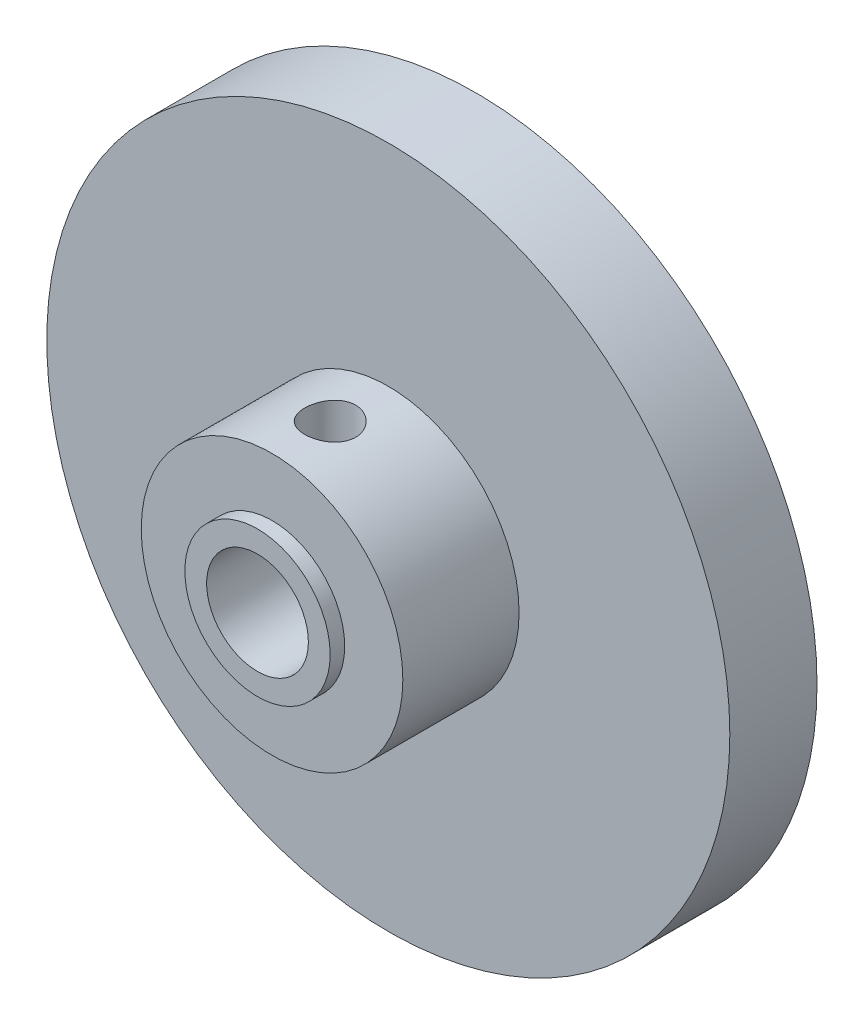
ISO-10303-21;
HEADER;
FILE_DESCRIPTION(('STEP AP214'),'2;1');
FILE_NAME('part.step','',(''),(''),'','','');
FILE_SCHEMA(('AUTOMOTIVE_DESIGN { 1 0 10303 214 1 1 1 1 }'));
ENDSEC;
DATA;
#1=APPLICATION_CONTEXT('core data for automotive mechanical design processes');
#2=APPLICATION_PROTOCOL_DEFINITION('international standard','automotive_design',2000,#1);
#3=PRODUCT_CONTEXT('',#1,'mechanical');
#4=PRODUCT('Part','Part','',(#3));
#5=PRODUCT_RELATED_PRODUCT_CATEGORY('part','',(#4));
#6=PRODUCT_DEFINITION_FORMATION('','',#4);
#7=PRODUCT_DEFINITION_CONTEXT('part definition',#1,'design');
#8=PRODUCT_DEFINITION('design','',#6,#7);
#9=PRODUCT_DEFINITION_SHAPE('','',#8);
#10=(LENGTH_UNIT() NAMED_UNIT(*) SI_UNIT(.MILLI.,.METRE.));
#11=(NAMED_UNIT(*) PLANE_ANGLE_UNIT() SI_UNIT($,.RADIAN.));
#12=(NAMED_UNIT(*) SI_UNIT($,.STERADIAN.) SOLID_ANGLE_UNIT());
#13=UNCERTAINTY_MEASURE_WITH_UNIT(LENGTH_MEASURE(1.E-05),#10,'distance_accuracy_value','');
#14=(GEOMETRIC_REPRESENTATION_CONTEXT(3) GLOBAL_UNCERTAINTY_ASSIGNED_CONTEXT((#13)) GLOBAL_UNIT_ASSIGNED_CONTEXT((#10,
#11,#12)) REPRESENTATION_CONTEXT('',''));
#15=CARTESIAN_POINT('',(0.,0.,0.));
#16=DIRECTION('',(0.,0.,1.));
#17=DIRECTION('',(1.,0.,0.));
#18=AXIS2_PLACEMENT_3D('',#15,#16,#17);
#19=CARTESIAN_POINT('',(0.,0.,14.));
#20=DIRECTION('',(0.,0.,1.));
#21=DIRECTION('',(1.,0.,0.));
#22=AXIS2_PLACEMENT_3D('',#19,#20,#21);
#23=PLANE('',#22);
#24=CARTESIAN_POINT('',(0.,0.,14.));
#25=DIRECTION('',(0.,0.,1.));
#26=DIRECTION('',(1.,0.,0.));
#27=AXIS2_PLACEMENT_3D('',#24,#25,#26);
#28=CIRCLE('',#27,9.);
#29=CARTESIAN_POINT('',(9.,0.,14.));
#30=VERTEX_POINT('',#29);
#31=EDGE_CURVE('E50',#30,#30,#28,.T.);
#32=ORIENTED_EDGE('',*,*,#31,.T.);
#33=EDGE_LOOP('',(#32));
#34=FACE_BOUND('',#33,.T.);
#35=CARTESIAN_POINT('',(0.,0.,14.));
#36=DIRECTION('',(0.,0.,1.));
#37=DIRECTION('',(1.,0.,0.));
#38=AXIS2_PLACEMENT_3D('',#35,#36,#37);
#39=CIRCLE('',#38,5.);
#40=CARTESIAN_POINT('',(5.,0.,14.));
#41=VERTEX_POINT('',#40);
#42=EDGE_CURVE('E66',#41,#41,#39,.T.);
#43=ORIENTED_EDGE('',*,*,#42,.F.);
#44=EDGE_LOOP('',(#43));
#45=FACE_BOUND('',#44,.T.);
#46=ADVANCED_FACE('F33',(#34,#45),#23,.T.);
#47=CARTESIAN_POINT('',(0.,0.,14.));
#48=DIRECTION('',(0.,0.,-1.));
#49=DIRECTION('',(-1.,0.,0.));
#50=AXIS2_PLACEMENT_3D('',#47,#48,#49);
#51=CYLINDRICAL_SURFACE('',#50,9.);
#52=CARTESIAN_POINT('',(0.,0.,6.));
#53=DIRECTION('',(0.,0.,1.));
#54=DIRECTION('',(1.,0.,0.));
#55=AXIS2_PLACEMENT_3D('',#52,#53,#54);
#56=CIRCLE('',#55,9.);
#57=CARTESIAN_POINT('',(9.,0.,6.));
#58=VERTEX_POINT('',#57);
#59=EDGE_CURVE('E52',#58,#58,#56,.T.);
#60=ORIENTED_EDGE('',*,*,#59,.T.);
#61=EDGE_LOOP('',(#60));
#62=FACE_BOUND('',#61,.T.);
#63=ORIENTED_EDGE('',*,*,#31,.F.);
#64=EDGE_LOOP('',(#63));
#65=FACE_BOUND('',#64,.T.);
#66=CARTESIAN_POINT('',(0.,9.,8.25));
#67=CARTESIAN_POINT('',(-0.0973156836062089,8.99999821772445,8.25000364449862));
#68=CARTESIAN_POINT('',(-0.194678040802686,8.99840536590685,8.25814486508741));
#69=CARTESIAN_POINT('',(-0.386654525996942,8.99220475390969,8.29047099708498));
#70=CARTESIAN_POINT('',(-0.481266343194959,8.98759453108666,8.3146690135571));
#71=CARTESIAN_POINT('',(-0.664937996409675,8.97587438816909,8.37833603279002));
#72=CARTESIAN_POINT('',(-0.754002923611564,8.96876680129341,8.41779078504737));
#73=CARTESIAN_POINT('',(-0.924241885844075,8.95282616245856,8.5108098011327));
#74=CARTESIAN_POINT('',(-1.00541646623287,8.94399322987754,8.56437308886842));
#75=CARTESIAN_POINT('',(-1.15861949618251,8.92544854462387,8.68481801544468));
#76=CARTESIAN_POINT('',(-1.23053205090738,8.91572785496434,8.75184570852366));
#77=CARTESIAN_POINT('',(-1.36216658793173,8.89656884633763,8.89700270803871));
#78=CARTESIAN_POINT('',(-1.42188765332038,8.88713054865443,8.97513284873082));
#79=CARTESIAN_POINT('',(-1.52793216432715,8.86951788037708,9.14110397111488));
#80=CARTESIAN_POINT('',(-1.57413655878561,8.86135501974221,9.22902234782648));
#81=CARTESIAN_POINT('',(-1.65107372787243,8.84734393358533,9.41155917088211));
#82=CARTESIAN_POINT('',(-1.68180794266537,8.84149549261801,9.50617699261931));
#83=CARTESIAN_POINT('',(-1.72655801443223,8.83286564018682,9.69818299947752));
#84=CARTESIAN_POINT('',(-1.74077666208466,8.83004705858871,9.79552221670059));
#85=CARTESIAN_POINT('',(-1.75272167469911,8.8276840924615,9.99124230022008));
#86=CARTESIAN_POINT('',(-1.75044963192146,8.82813939182243,10.0896230650338));
#87=CARTESIAN_POINT('',(-1.72964193315875,8.83223894113571,10.2831564750504));
#88=CARTESIAN_POINT('',(-1.71133789823936,8.83583777311584,10.3783351278753));
#89=CARTESIAN_POINT('',(-1.65935102622045,8.84574745533293,10.5642444043898));
#90=CARTESIAN_POINT('',(-1.62566749113262,8.85205842865785,10.6549748259923));
#91=CARTESIAN_POINT('',(-1.54365419238729,8.8667282121507,10.8300842502408));
#92=CARTESIAN_POINT('',(-1.49523184685119,8.87509990120757,10.9144187681796));
#93=CARTESIAN_POINT('',(-1.3851808520573,8.89293945847091,11.0738525122127));
#94=CARTESIAN_POINT('',(-1.32355076506605,8.90240744596371,11.1489507314845));
#95=CARTESIAN_POINT('',(-1.18758968951822,8.92157007269816,11.2891174132895));
#96=CARTESIAN_POINT('',(-1.11306082058521,8.93126583077739,11.3539939321044));
#97=CARTESIAN_POINT('',(-0.954077421569153,8.94964408707819,11.4703536895289));
#98=CARTESIAN_POINT('',(-0.869622777211406,8.95832657363176,11.5218367739192));
#99=CARTESIAN_POINT('',(-0.692977848986431,8.97371958042028,11.6099804778007));
#100=CARTESIAN_POINT('',(-0.600776803288871,8.98042729693397,11.646620050377));
#101=CARTESIAN_POINT('',(-0.411368845280849,8.99109353993251,11.7038368120045));
#102=CARTESIAN_POINT('',(-0.314162506919113,8.99505238087568,11.7244158383393));
#103=CARTESIAN_POINT('',(-0.119153602899692,8.99973129619662,11.74865766895));
#104=CARTESIAN_POINT('',(-0.0213848777429233,9.00050168497024,11.7525832921956));
#105=CARTESIAN_POINT('',(0.173411693275195,8.99885629934295,11.7441134129041));
#106=CARTESIAN_POINT('',(0.270439578130222,8.99644069381397,11.731718775414));
#107=CARTESIAN_POINT('',(0.460158769259966,8.98872615509347,11.6911786379996));
#108=CARTESIAN_POINT('',(0.552879796620057,8.98345176395529,11.6631671476413));
#109=CARTESIAN_POINT('',(0.732309171756702,8.97060876056953,11.592334244744));
#110=CARTESIAN_POINT('',(0.819017087238031,8.9630399835834,11.5495117687345));
#111=CARTESIAN_POINT('',(0.985073318514106,8.94632234279119,11.4496979727244));
#112=CARTESIAN_POINT('',(1.06432409538847,8.93715609353275,11.3925473536188));
#113=CARTESIAN_POINT('',(1.21220480902886,8.91830290791195,11.2659138832094));
#114=CARTESIAN_POINT('',(1.28083367246809,8.90861591906278,11.1964297871492));
#115=CARTESIAN_POINT('',(1.40652971644421,8.88964464547266,11.0459082611014));
#116=CARTESIAN_POINT('',(1.4634169455287,8.88036812973077,10.9647194133491));
#117=CARTESIAN_POINT('',(1.56274664411421,8.86342892548536,10.7937839073255));
#118=CARTESIAN_POINT('',(1.60518967404561,8.85576617437269,10.7040375812546));
#119=CARTESIAN_POINT('',(1.67417620220866,8.84298404690308,10.5189749760555));
#120=CARTESIAN_POINT('',(1.70079964467828,8.83785190492786,10.4236894214568));
#121=CARTESIAN_POINT('',(1.73763563092623,8.83068405262818,10.229887548852));
#122=CARTESIAN_POINT('',(1.74785018327051,8.82864796332628,10.1313716277727));
#123=CARTESIAN_POINT('',(1.75150730296477,8.82792297326674,9.93571032701452));
#124=CARTESIAN_POINT('',(1.74523399190086,8.82917736959248,9.83857035557477));
#125=CARTESIAN_POINT('',(1.71671825425596,8.83476575384817,9.64675824893353));
#126=CARTESIAN_POINT('',(1.69447594067522,8.83909971998639,9.55208609627411));
#127=CARTESIAN_POINT('',(1.63477724493332,8.85033422418497,9.36806518142127));
#128=CARTESIAN_POINT('',(1.59735386574452,8.85722919201355,9.27870535059161));
#129=CARTESIAN_POINT('',(1.50838724827545,8.87281232352071,9.10748792833059));
#130=CARTESIAN_POINT('',(1.45684290950311,8.88150062694672,9.02563092228246));
#131=CARTESIAN_POINT('',(1.34011926319955,8.89986611414857,8.87032416345969));
#132=CARTESIAN_POINT('',(1.27473404504482,8.90955695190391,8.79703075369162));
#133=CARTESIAN_POINT('',(1.13261176790831,8.92873573916035,8.6623618116299));
#134=CARTESIAN_POINT('',(1.05587210490262,8.93822364154751,8.60098902069333));
#135=CARTESIAN_POINT('',(0.892317108276772,8.95603687130174,8.49133841521965));
#136=CARTESIAN_POINT('',(0.805410441012034,8.96434990016989,8.44319476256145));
#137=CARTESIAN_POINT('',(0.624605421667268,8.97875614908294,8.36227011340117));
#138=CARTESIAN_POINT('',(0.530713584204253,8.98485140700041,8.32947500540385));
#139=CARTESIAN_POINT('',(0.363817397281653,8.99292466438293,8.28666921790843));
#140=CARTESIAN_POINT('',(0.291775007462714,8.99556263471093,8.27294231526043));
#141=CARTESIAN_POINT('',(0.146497206166159,8.99910094833246,8.25460646596312));
#142=CARTESIAN_POINT('',(0.0732618291602869,9.00000134174433,8.24999725632472));
#143=CARTESIAN_POINT('',(0.,9.,8.25));
#144=B_SPLINE_CURVE_WITH_KNOTS('',3,(#66,#67,#68,#69,#70,#71,#72,#73,#74,#75,#76,#77,#78,#79,
#80,#81,#82,#83,#84,#85,#86,#87,#88,#89,#90,#91,#92,#93,#94,#95,#96,#97,#98,#99,#100,#101,#102,
#103,#104,#105,#106,#107,#108,#109,#110,#111,#112,#113,#114,#115,#116,#117,#118,#119,#120,#121,
#122,#123,#124,#125,#126,#127,#128,#129,#130,#131,#132,#133,#134,#135,#136,#137,#138,#139,#140,
#141,#142,#143),.UNSPECIFIED.,.T.,.F.,(4,2,2,2,2,2,2,2,2,2,2,2,2,2,2,2,2,2,2,2,2,2,2,2,2,2,2,2,
2,2,2,2,2,2,2,2,2,2,4),(0.,0.291679078326977,0.583596509446674,0.875241932123743,
1.16686718274949,1.46184556749473,1.75684612912919,2.05437172284606,2.35186961390437,
2.64567463922136,2.93945129654077,3.22905237385875,3.51866659583435,3.8101389472194,
4.10164304306326,4.398096556371,4.69455348305972,4.99142930303896,5.28827115623629,
5.58041049779943,5.8725343552942,6.162189221305,6.45186488967029,6.74491624829805,
7.03799719997528,7.33528189387179,7.6325550519006,7.92831287468502,8.22403449182947,
8.51469373248319,8.80535091638686,9.09537958194325,9.38543085680484,9.68014586459743,
9.97492856728051,10.2725988388051,10.5699948911836,10.7895849757709,11.0091687264486),.UNSPECIFIED.);
#145=CARTESIAN_POINT('',(0.,9.,8.25));
#146=VERTEX_POINT('',#145);
#147=EDGE_CURVE('E60',#146,#146,#144,.T.);
#148=ORIENTED_EDGE('',*,*,#147,.F.);
#149=EDGE_LOOP('',(#148));
#150=FACE_BOUND('',#149,.T.);
#151=ADVANCED_FACE('F68',(#62,#65,#150),#51,.T.);
#152=CARTESIAN_POINT('',(0.,0.,0.));
#153=DIRECTION('',(0.,0.,1.));
#154=DIRECTION('',(1.,0.,0.));
#155=AXIS2_PLACEMENT_3D('',#152,#153,#154);
#156=CYLINDRICAL_SURFACE('',#155,3.5);
#157=CARTESIAN_POINT('',(0.,0.,0.));
#158=DIRECTION('',(0.,0.,1.));
#159=DIRECTION('',(1.,0.,0.));
#160=AXIS2_PLACEMENT_3D('',#157,#158,#159);
#161=CIRCLE('',#160,3.5);
#162=CARTESIAN_POINT('',(3.5,0.,0.));
#163=VERTEX_POINT('',#162);
#164=EDGE_CURVE('E55',#163,#163,#161,.T.);
#165=ORIENTED_EDGE('',*,*,#164,.F.);
#166=EDGE_LOOP('',(#165));
#167=FACE_BOUND('',#166,.T.);
#168=CARTESIAN_POINT('',(0.,3.5,8.25));
#169=CARTESIAN_POINT('',(0.0920009351646587,3.49999498458822,8.25000577905509));
#170=CARTESIAN_POINT('',(0.184111549470734,3.49633359284574,8.25729762796185));
#171=CARTESIAN_POINT('',(0.365610411720568,3.48204773065025,8.28614254059769));
#172=CARTESIAN_POINT('',(0.454993151748851,3.47141003700609,8.30772268774618));
#173=CARTESIAN_POINT('',(0.628133703540785,3.44428488955907,8.3640891650791));
#174=CARTESIAN_POINT('',(0.711911905143506,3.4278201856069,8.39882417243394));
#175=CARTESIAN_POINT('',(0.872327079411547,3.39055108902583,8.48024858738872));
#176=CARTESIAN_POINT('',(0.948964614482603,3.36974703858669,8.52693705243551));
#177=CARTESIAN_POINT('',(1.09813868108334,3.32423451951608,8.63415518659925));
#178=CARTESIAN_POINT('',(1.17014661946369,3.2993659847319,8.69535133866937));
#179=CARTESIAN_POINT('',(1.30336402851721,3.249049479318,8.82841258868231));
#180=CARTESIAN_POINT('',(1.36456527043684,3.22360108365811,8.90028574060177));
#181=CARTESIAN_POINT('',(1.47919100078799,3.17273164595358,9.05934586166592));
#182=CARTESIAN_POINT('',(1.53164433721536,3.14746577197731,9.14728817210535));
#183=CARTESIAN_POINT('',(1.62079439705872,3.10250462851561,9.33214283797588));
#184=CARTESIAN_POINT('',(1.65750237619108,3.08280538312232,9.42904872526481));
#185=CARTESIAN_POINT('',(1.71173177383003,3.05301267316165,9.62316393448837));
#186=CARTESIAN_POINT('',(1.73027024989077,3.04241475271499,9.72000779111794));
#187=CARTESIAN_POINT('',(1.75074723829048,3.03068307409923,9.91596296611409));
#188=CARTESIAN_POINT('',(1.75270215465288,3.02953996350754,10.0150719465245));
#189=CARTESIAN_POINT('',(1.74070275255151,3.03644127950185,10.2000005425519));
#190=CARTESIAN_POINT('',(1.72862297918944,3.04340336408524,10.2859920546403));
#191=CARTESIAN_POINT('',(1.69214473584963,3.06383400284238,10.4545133414028));
#192=CARTESIAN_POINT('',(1.66774234182089,3.07730462955609,10.5370420042843));
#193=CARTESIAN_POINT('',(1.60686711567551,3.10953083722297,10.6986509819899));
#194=CARTESIAN_POINT('',(1.57012636745299,3.12840221161998,10.7776061978751));
#195=CARTESIAN_POINT('',(1.485822953419,3.16930957492456,10.9286100120325));
#196=CARTESIAN_POINT('',(1.43825542667182,3.19134698365334,11.0006554873002));
#197=CARTESIAN_POINT('',(1.32661559609738,3.2394802633075,11.1454121923006));
#198=CARTESIAN_POINT('',(1.26121530214624,3.26573642914306,11.2170495287583));
#199=CARTESIAN_POINT('',(1.1192222627974,3.31708340775713,11.3487869825341));
#200=CARTESIAN_POINT('',(1.042624199005,3.34217365927902,11.4088815860593));
#201=CARTESIAN_POINT('',(0.875903885205734,3.38978477745187,11.518449906802));
#202=CARTESIAN_POINT('',(0.785318785298965,3.41213222283513,11.56730082678));
#203=CARTESIAN_POINT('',(0.595815877105394,3.45026291962174,11.6486698008253));
#204=CARTESIAN_POINT('',(0.496904758464232,3.46605138151218,11.6812008237765));
#205=CARTESIAN_POINT('',(0.302341360406228,3.48817584047512,11.7263319565042));
#206=CARTESIAN_POINT('',(0.20709767845957,3.49518642027292,11.7403596625569));
#207=CARTESIAN_POINT('',(0.0153642999113644,3.50127773553431,11.7525632794854));
#208=CARTESIAN_POINT('',(-0.0811247847723411,3.50036222762308,11.7507466998691));
#209=CARTESIAN_POINT('',(-0.264657700975478,3.49109586443511,11.7321382952672));
#210=CARTESIAN_POINT('',(-0.351853964087378,3.48332679954295,11.7165180677225));
#211=CARTESIAN_POINT('',(-0.522212061528397,3.4618879980097,11.6725833741835));
#212=CARTESIAN_POINT('',(-0.605373449959403,3.44821761085221,11.6442675087064));
#213=CARTESIAN_POINT('',(-0.768055064786753,3.41572439973779,11.5750026837422));
#214=CARTESIAN_POINT('',(-0.847403194760156,3.39676543096854,11.5337156622965));
#215=CARTESIAN_POINT('',(-0.998307382973725,3.35551955055481,11.4400618126185));
#216=CARTESIAN_POINT('',(-1.06986010210904,3.33323122242142,11.3876902644581));
#217=CARTESIAN_POINT('',(-1.21059345625613,3.28489387338346,11.2674192556712));
#218=CARTESIAN_POINT('',(-1.2788511361833,3.25869048476124,11.198499980221));
#219=CARTESIAN_POINT('',(-1.403248561958,3.20709185315435,11.050130985264));
#220=CARTESIAN_POINT('',(-1.45937992499578,3.18169717950082,10.9706740420161));
#221=CARTESIAN_POINT('',(-1.56048885033828,3.13339586361356,10.7986236051973));
#222=CARTESIAN_POINT('',(-1.60479461765043,3.11066926780856,10.7055802843347));
#223=CARTESIAN_POINT('',(-1.67664494538573,3.07254626514736,10.5118573817438));
#224=CARTESIAN_POINT('',(-1.70421110276728,3.05714041888062,10.4111878286829));
#225=CARTESIAN_POINT('',(-1.73925795306703,3.03732626795154,10.2154071099518));
#226=CARTESIAN_POINT('',(-1.74841274370954,3.03200421063864,10.1206900564883));
#227=CARTESIAN_POINT('',(-1.75120602015835,3.03039370622806,9.93096763246208));
#228=CARTESIAN_POINT('',(-1.74485123159067,3.03410134346183,9.83596240470874));
#229=CARTESIAN_POINT('',(-1.71837071978829,3.04916258589384,9.65790387231648));
#230=CARTESIAN_POINT('',(-1.69961455010031,3.05975415344652,9.57457417724671));
#231=CARTESIAN_POINT('',(-1.65055687689272,3.08649278328392,9.41233579100736));
#232=CARTESIAN_POINT('',(-1.62025165952986,3.1026416324692,9.33342853133894));
#233=CARTESIAN_POINT('',(-1.54667755427599,3.13999928137938,9.17640651077356));
#234=CARTESIAN_POINT('',(-1.50267449117747,3.16147514192861,9.0987011717992));
#235=CARTESIAN_POINT('',(-1.40376420036543,3.20661830361006,8.9512695616828));
#236=CARTESIAN_POINT('',(-1.34885129967273,3.23028674142319,8.88154747158806));
#237=CARTESIAN_POINT('',(-1.2218558216574,3.28059065526661,8.74325153087932));
#238=CARTESIAN_POINT('',(-1.1484977402452,3.30723720786599,8.67584657088699));
#239=CARTESIAN_POINT('',(-0.990770910908092,3.35786066454879,8.55403977898828));
#240=CARTESIAN_POINT('',(-0.906396265784092,3.38183612595841,8.49964495592766));
#241=CARTESIAN_POINT('',(-0.727880294370152,3.4247151674144,8.40533636525388));
#242=CARTESIAN_POINT('',(-0.633674131609276,3.44358168864383,8.36552770383618));
#243=CARTESIAN_POINT('',(-0.438798676991649,3.47377347273227,8.30283570642453));
#244=CARTESIAN_POINT('',(-0.338148649280922,3.48512015885369,8.27990426809));
#245=CARTESIAN_POINT('',(-0.197053406359064,3.49467058348586,8.26067953059995));
#246=CARTESIAN_POINT('',(-0.157783289022736,3.49666389345439,8.25668037848391));
#247=CARTESIAN_POINT('',(-0.079015530658909,3.49932969709427,8.25133933535035));
#248=CARTESIAN_POINT('',(-0.039517883381599,3.50000215430917,8.24999751767714));
#249=CARTESIAN_POINT('',(0.,3.5,8.25));
#250=B_SPLINE_CURVE_WITH_KNOTS('',3,(#168,#169,#170,#171,#172,#173,#174,#175,#176,#177,#178,
#179,#180,#181,#182,#183,#184,#185,#186,#187,#188,#189,#190,#191,#192,#193,#194,#195,#196,#197,
#198,#199,#200,#201,#202,#203,#204,#205,#206,#207,#208,#209,#210,#211,#212,#213,#214,#215,#216,
#217,#218,#219,#220,#221,#222,#223,#224,#225,#226,#227,#228,#229,#230,#231,#232,#233,#234,#235,
#236,#237,#238,#239,#240,#241,#242,#243,#244,#245,#246,#247,#248,#249),.UNSPECIFIED.,.T.,.F.,(4,
2,2,2,2,2,2,2,2,2,2,2,2,2,2,2,2,2,2,2,2,2,2,2,2,2,2,2,2,2,2,2,2,2,2,2,2,2,2,2,4),(0.,
0.275842450485511,0.552209261991096,0.827508772111521,1.10278658101774,1.39471807775665,
1.68687091589456,2.00168021253817,2.31626408821992,2.61201521245402,2.90747375325786,
3.16759996716311,3.42780906869937,3.69407920294853,3.96046912205388,4.26063647334287,
4.56094685547701,4.87520288875271,5.18920879596489,5.47720758324855,5.76506987895083,
6.03062086385713,6.2962011285413,6.56937498048822,6.84266538809593,7.14279318627733,
7.44312780077005,7.7580069378302,8.07247895904539,8.35676288130331,8.64092354763187,
8.89801377935497,9.15518675379614,9.42963799365502,9.70423232001353,10.0121917482505,
10.3203167091718,10.6306202391117,10.9400359008701,11.0585174023435,11.1770021739436),.UNSPECIFIED.);
#251=CARTESIAN_POINT('',(0.,3.5,8.25));
#252=VERTEX_POINT('',#251);
#253=EDGE_CURVE('E37',#252,#252,#250,.T.);
#254=ORIENTED_EDGE('',*,*,#253,.F.);
#255=EDGE_LOOP('',(#254));
#256=FACE_BOUND('',#255,.T.);
#257=CARTESIAN_POINT('',(0.,0.,15.));
#258=DIRECTION('',(0.,0.,1.));
#259=DIRECTION('',(1.,0.,0.));
#260=AXIS2_PLACEMENT_3D('',#257,#258,#259);
#261=CIRCLE('',#260,3.5);
#262=CARTESIAN_POINT('',(3.5,0.,15.));
#263=VERTEX_POINT('',#262);
#264=EDGE_CURVE('E99',#263,#263,#261,.T.);
#265=ORIENTED_EDGE('',*,*,#264,.T.);
#266=EDGE_LOOP('',(#265));
#267=FACE_BOUND('',#266,.T.);
#268=ADVANCED_FACE('F81',(#167,#256,#267),#156,.F.);
#269=CARTESIAN_POINT('',(0.,0.,6.));
#270=DIRECTION('',(0.,0.,1.));
#271=DIRECTION('',(1.,0.,0.));
#272=AXIS2_PLACEMENT_3D('',#269,#270,#271);
#273=PLANE('',#272);
#274=CARTESIAN_POINT('',(0.,0.,6.));
#275=DIRECTION('',(0.,0.,1.));
#276=DIRECTION('',(1.,0.,0.));
#277=AXIS2_PLACEMENT_3D('',#274,#275,#276);
#278=CIRCLE('',#277,23.5);
#279=CARTESIAN_POINT('',(23.5,0.,6.));
#280=VERTEX_POINT('',#279);
#281=EDGE_CURVE('E10',#280,#280,#278,.T.);
#282=ORIENTED_EDGE('',*,*,#281,.T.);
#283=EDGE_LOOP('',(#282));
#284=FACE_BOUND('',#283,.T.);
#285=ORIENTED_EDGE('',*,*,#59,.F.);
#286=EDGE_LOOP('',(#285));
#287=FACE_BOUND('',#286,.T.);
#288=ADVANCED_FACE('F85',(#284,#287),#273,.T.);
#289=CARTESIAN_POINT('',(0.,0.,6.));
#290=DIRECTION('',(0.,0.,-1.));
#291=DIRECTION('',(-1.,0.,0.));
#292=AXIS2_PLACEMENT_3D('',#289,#290,#291);
#293=CYLINDRICAL_SURFACE('',#292,23.5);
#294=ORIENTED_EDGE('',*,*,#281,.F.);
#295=EDGE_LOOP('',(#294));
#296=FACE_BOUND('',#295,.T.);
#297=CARTESIAN_POINT('',(0.,0.,0.));
#298=DIRECTION('',(0.,0.,1.));
#299=DIRECTION('',(1.,0.,0.));
#300=AXIS2_PLACEMENT_3D('',#297,#298,#299);
#301=CIRCLE('',#300,23.5);
#302=CARTESIAN_POINT('',(23.5,0.,0.));
#303=VERTEX_POINT('',#302);
#304=EDGE_CURVE('E45',#303,#303,#301,.T.);
#305=ORIENTED_EDGE('',*,*,#304,.T.);
#306=EDGE_LOOP('',(#305));
#307=FACE_BOUND('',#306,.T.);
#308=ADVANCED_FACE('F35',(#296,#307),#293,.T.);
#309=CARTESIAN_POINT('',(0.,0.,0.));
#310=DIRECTION('',(0.,0.,1.));
#311=DIRECTION('',(1.,0.,0.));
#312=AXIS2_PLACEMENT_3D('',#309,#310,#311);
#313=PLANE('',#312);
#314=ORIENTED_EDGE('',*,*,#164,.T.);
#315=EDGE_LOOP('',(#314));
#316=FACE_BOUND('',#315,.T.);
#317=ORIENTED_EDGE('',*,*,#304,.F.);
#318=EDGE_LOOP('',(#317));
#319=FACE_BOUND('',#318,.T.);
#320=ADVANCED_FACE('F77',(#316,#319),#313,.F.);
#321=CARTESIAN_POINT('',(0.,23.5,10.));
#322=DIRECTION('',(0.,-1.,0.));
#323=DIRECTION('',(0.,0.,-1.));
#324=AXIS2_PLACEMENT_3D('',#321,#322,#323);
#325=CYLINDRICAL_SURFACE('',#324,1.75);
#326=ORIENTED_EDGE('',*,*,#253,.T.);
#327=EDGE_LOOP('',(#326));
#328=FACE_BOUND('',#327,.T.);
#329=ORIENTED_EDGE('',*,*,#147,.T.);
#330=EDGE_LOOP('',(#329));
#331=FACE_BOUND('',#330,.T.);
#332=ADVANCED_FACE('F72',(#328,#331),#325,.F.);
#333=CARTESIAN_POINT('',(0.,0.,15.));
#334=DIRECTION('',(0.,0.,1.));
#335=DIRECTION('',(1.,0.,0.));
#336=AXIS2_PLACEMENT_3D('',#333,#334,#335);
#337=PLANE('',#336);
#338=CARTESIAN_POINT('',(0.,0.,15.));
#339=DIRECTION('',(0.,0.,1.));
#340=DIRECTION('',(1.,0.,0.));
#341=AXIS2_PLACEMENT_3D('',#338,#339,#340);
#342=CIRCLE('',#341,5.);
#343=CARTESIAN_POINT('',(5.,0.,15.));
#344=VERTEX_POINT('',#343);
#345=EDGE_CURVE('E98',#344,#344,#342,.T.);
#346=ORIENTED_EDGE('',*,*,#345,.T.);
#347=EDGE_LOOP('',(#346));
#348=FACE_BOUND('',#347,.T.);
#349=ORIENTED_EDGE('',*,*,#264,.F.);
#350=EDGE_LOOP('',(#349));
#351=FACE_BOUND('',#350,.T.);
#352=ADVANCED_FACE('F76',(#348,#351),#337,.T.);
#353=CARTESIAN_POINT('',(0.,0.,15.));
#354=DIRECTION('',(0.,0.,-1.));
#355=DIRECTION('',(-1.,0.,0.));
#356=AXIS2_PLACEMENT_3D('',#353,#354,#355);
#357=CYLINDRICAL_SURFACE('',#356,5.);
#358=ORIENTED_EDGE('',*,*,#345,.F.);
#359=EDGE_LOOP('',(#358));
#360=FACE_BOUND('',#359,.T.);
#361=ORIENTED_EDGE('',*,*,#42,.T.);
#362=EDGE_LOOP('',(#361));
#363=FACE_BOUND('',#362,.T.);
#364=ADVANCED_FACE('F79',(#360,#363),#357,.T.);
#365=CLOSED_SHELL('',(#46,#151,#268,#288,#308,#320,#332,#352,#364));
#366=MANIFOLD_SOLID_BREP('B2',#365);
#367=ADVANCED_BREP_SHAPE_REPRESENTATION('',(#18,#366),#14);
#368=SHAPE_DEFINITION_REPRESENTATION(#9,#367);
ENDSEC;
END-ISO-10303-21;
